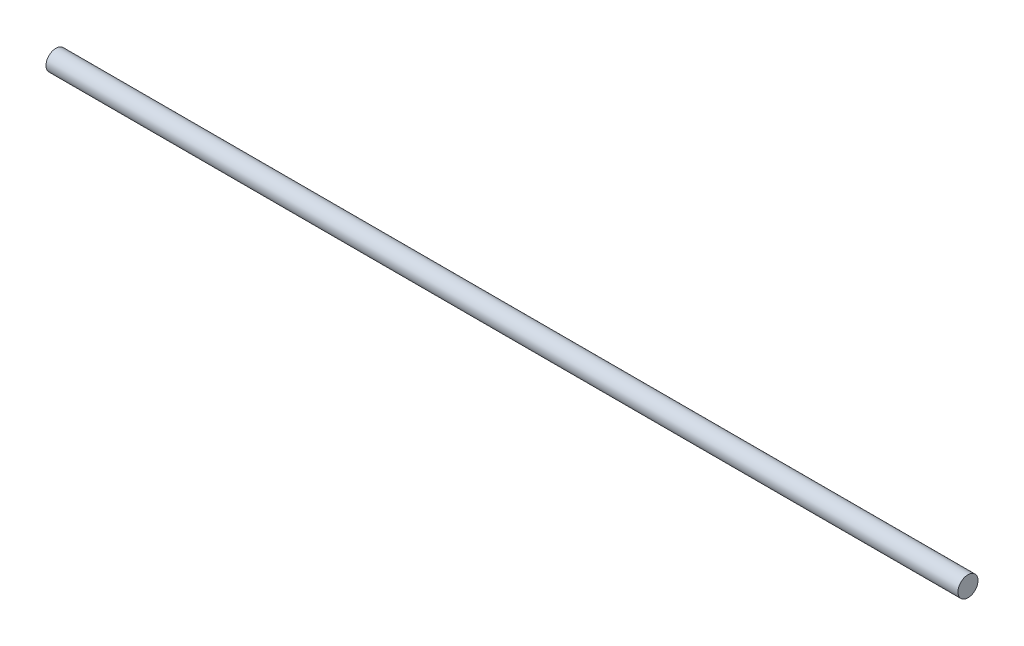
ISO-10303-21;
HEADER;
FILE_DESCRIPTION(('STEP AP214'),'2;1');
FILE_NAME('part.step','',(''),(''),'','','');
FILE_SCHEMA(('AUTOMOTIVE_DESIGN { 1 0 10303 214 1 1 1 1 }'));
ENDSEC;
DATA;
#1=APPLICATION_CONTEXT('core data for automotive mechanical design processes');
#2=APPLICATION_PROTOCOL_DEFINITION('international standard','automotive_design',2000,#1);
#3=PRODUCT_CONTEXT('',#1,'mechanical');
#4=PRODUCT('Part','Part','',(#3));
#5=PRODUCT_RELATED_PRODUCT_CATEGORY('part','',(#4));
#6=PRODUCT_DEFINITION_FORMATION('','',#4);
#7=PRODUCT_DEFINITION_CONTEXT('part definition',#1,'design');
#8=PRODUCT_DEFINITION('design','',#6,#7);
#9=PRODUCT_DEFINITION_SHAPE('','',#8);
#10=(LENGTH_UNIT() NAMED_UNIT(*) SI_UNIT(.MILLI.,.METRE.));
#11=(NAMED_UNIT(*) PLANE_ANGLE_UNIT() SI_UNIT($,.RADIAN.));
#12=(NAMED_UNIT(*) SI_UNIT($,.STERADIAN.) SOLID_ANGLE_UNIT());
#13=UNCERTAINTY_MEASURE_WITH_UNIT(LENGTH_MEASURE(1.E-05),#10,'distance_accuracy_value','');
#14=(GEOMETRIC_REPRESENTATION_CONTEXT(3) GLOBAL_UNCERTAINTY_ASSIGNED_CONTEXT((#13)) GLOBAL_UNIT_ASSIGNED_CONTEXT((#10,
#11,#12)) REPRESENTATION_CONTEXT('',''));
#15=CARTESIAN_POINT('',(0.,0.,0.));
#16=DIRECTION('',(0.,0.,1.));
#17=DIRECTION('',(1.,0.,0.));
#18=AXIS2_PLACEMENT_3D('',#15,#16,#17);
#19=CARTESIAN_POINT('',(288.925,0.,0.));
#20=DIRECTION('',(-1.,0.,0.));
#21=DIRECTION('',(0.,0.,1.));
#22=AXIS2_PLACEMENT_3D('',#19,#20,#21);
#23=CYLINDRICAL_SURFACE('',#22,3.175);
#24=CARTESIAN_POINT('',(288.925,0.,0.));
#25=DIRECTION('',(1.,0.,0.));
#26=DIRECTION('',(0.,0.,-1.));
#27=AXIS2_PLACEMENT_3D('',#24,#25,#26);
#28=CIRCLE('',#27,3.175);
#29=CARTESIAN_POINT('',(288.925,0.,-3.175));
#30=VERTEX_POINT('',#29);
#31=EDGE_CURVE('E10',#30,#30,#28,.T.);
#32=ORIENTED_EDGE('',*,*,#31,.F.);
#33=EDGE_LOOP('',(#32));
#34=FACE_BOUND('',#33,.T.);
#35=CARTESIAN_POINT('',(0.,0.,0.));
#36=DIRECTION('',(1.,0.,0.));
#37=DIRECTION('',(0.,0.,-1.));
#38=AXIS2_PLACEMENT_3D('',#35,#36,#37);
#39=CIRCLE('',#38,3.175);
#40=CARTESIAN_POINT('',(0.,0.,-3.175));
#41=VERTEX_POINT('',#40);
#42=EDGE_CURVE('E40',#41,#41,#39,.T.);
#43=ORIENTED_EDGE('',*,*,#42,.T.);
#44=EDGE_LOOP('',(#43));
#45=FACE_BOUND('',#44,.T.);
#46=ADVANCED_FACE('F37',(#34,#45),#23,.T.);
#47=CARTESIAN_POINT('',(288.925,0.,0.));
#48=DIRECTION('',(1.,0.,0.));
#49=DIRECTION('',(0.,0.,-1.));
#50=AXIS2_PLACEMENT_3D('',#47,#48,#49);
#51=PLANE('',#50);
#52=ORIENTED_EDGE('',*,*,#31,.T.);
#53=EDGE_LOOP('',(#52));
#54=FACE_BOUND('',#53,.T.);
#55=ADVANCED_FACE('F54',(#54),#51,.T.);
#56=CARTESIAN_POINT('',(0.,0.,0.));
#57=DIRECTION('',(1.,0.,0.));
#58=DIRECTION('',(0.,0.,-1.));
#59=AXIS2_PLACEMENT_3D('',#56,#57,#58);
#60=PLANE('',#59);
#61=ORIENTED_EDGE('',*,*,#42,.F.);
#62=EDGE_LOOP('',(#61));
#63=FACE_BOUND('',#62,.T.);
#64=ADVANCED_FACE('F52',(#63),#60,.F.);
#65=CLOSED_SHELL('',(#46,#55,#64));
#66=MANIFOLD_SOLID_BREP('B2',#65);
#67=ADVANCED_BREP_SHAPE_REPRESENTATION('',(#18,#66),#14);
#68=SHAPE_DEFINITION_REPRESENTATION(#9,#67);
ENDSEC;
END-ISO-10303-21;
